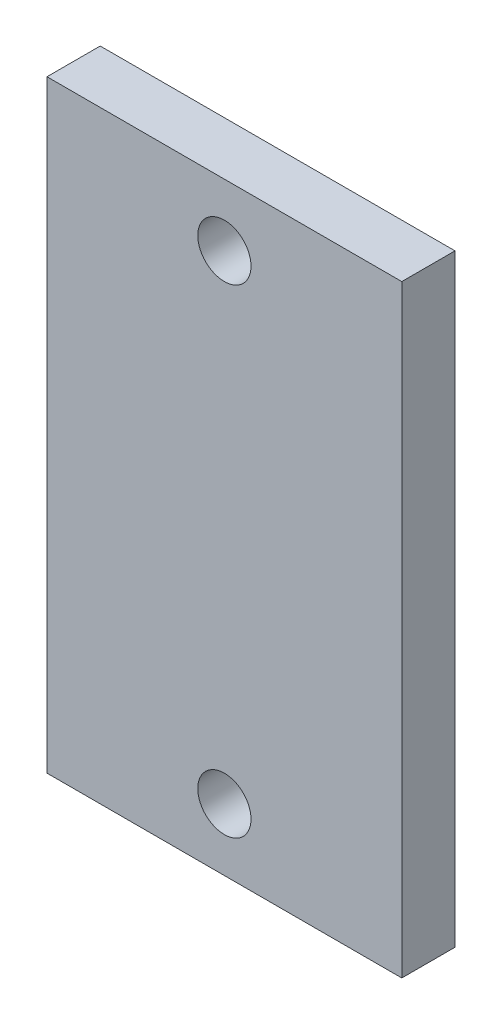
ISO-10303-21;
HEADER;
FILE_DESCRIPTION(('STEP AP214'),'2;1');
FILE_NAME('part.step','',(''),(''),'','','');
FILE_SCHEMA(('AUTOMOTIVE_DESIGN { 1 0 10303 214 1 1 1 1 }'));
ENDSEC;
DATA;
#1=APPLICATION_CONTEXT('core data for automotive mechanical design processes');
#2=APPLICATION_PROTOCOL_DEFINITION('international standard','automotive_design',2000,#1);
#3=PRODUCT_CONTEXT('',#1,'mechanical');
#4=PRODUCT('Part','Part','',(#3));
#5=PRODUCT_RELATED_PRODUCT_CATEGORY('part','',(#4));
#6=PRODUCT_DEFINITION_FORMATION('','',#4);
#7=PRODUCT_DEFINITION_CONTEXT('part definition',#1,'design');
#8=PRODUCT_DEFINITION('design','',#6,#7);
#9=PRODUCT_DEFINITION_SHAPE('','',#8);
#10=(LENGTH_UNIT() NAMED_UNIT(*) SI_UNIT(.MILLI.,.METRE.));
#11=(NAMED_UNIT(*) PLANE_ANGLE_UNIT() SI_UNIT($,.RADIAN.));
#12=(NAMED_UNIT(*) SI_UNIT($,.STERADIAN.) SOLID_ANGLE_UNIT());
#13=UNCERTAINTY_MEASURE_WITH_UNIT(LENGTH_MEASURE(1.E-05),#10,'distance_accuracy_value','');
#14=(GEOMETRIC_REPRESENTATION_CONTEXT(3) GLOBAL_UNCERTAINTY_ASSIGNED_CONTEXT((#13)) GLOBAL_UNIT_ASSIGNED_CONTEXT((#10,
#11,#12)) REPRESENTATION_CONTEXT('',''));
#15=CARTESIAN_POINT('',(0.,0.,0.));
#16=DIRECTION('',(0.,0.,1.));
#17=DIRECTION('',(1.,0.,0.));
#18=AXIS2_PLACEMENT_3D('',#15,#16,#17);
#19=CARTESIAN_POINT('',(0.,0.,3.));
#20=DIRECTION('',(0.,0.,1.));
#21=DIRECTION('',(1.,0.,0.));
#22=AXIS2_PLACEMENT_3D('',#19,#20,#21);
#23=PLANE('',#22);
#24=CARTESIAN_POINT('',(1.72404837269702,3.34684684684684,3.));
#25=DIRECTION('',(0.,0.,1.));
#26=DIRECTION('',(1.,0.,0.));
#27=AXIS2_PLACEMENT_3D('',#24,#25,#26);
#28=CIRCLE('',#27,1.5);
#29=CARTESIAN_POINT('',(3.22404837269702,3.34684684684684,3.));
#30=VERTEX_POINT('',#29);
#31=EDGE_CURVE('E99',#30,#30,#28,.T.);
#32=ORIENTED_EDGE('',*,*,#31,.F.);
#33=EDGE_LOOP('',(#32));
#34=FACE_BOUND('',#33,.T.);
#35=DIRECTION('',(0.,-1.,0.));
#36=VECTOR('',#35,1.);
#37=CARTESIAN_POINT('',(-8.27595162730299,6.84684684684685,3.));
#38=LINE('',#37,#36);
#39=CARTESIAN_POINT('',(-8.27595162730299,6.84684684684685,3.));
#40=VERTEX_POINT('',#39);
#41=CARTESIAN_POINT('',(-8.27595162730299,-27.1531531531532,3.));
#42=VERTEX_POINT('',#41);
#43=EDGE_CURVE('E84',#40,#42,#38,.T.);
#44=ORIENTED_EDGE('',*,*,#43,.T.);
#45=DIRECTION('',(1.,0.,0.));
#46=VECTOR('',#45,1.);
#47=CARTESIAN_POINT('',(-8.27595162730299,-27.1531531531532,3.));
#48=LINE('',#47,#46);
#49=CARTESIAN_POINT('',(11.724048372697,-27.1531531531532,3.));
#50=VERTEX_POINT('',#49);
#51=EDGE_CURVE('E79',#42,#50,#48,.T.);
#52=ORIENTED_EDGE('',*,*,#51,.T.);
#53=DIRECTION('',(0.,1.,0.));
#54=VECTOR('',#53,1.);
#55=CARTESIAN_POINT('',(11.724048372697,6.84684684684685,3.));
#56=LINE('',#55,#54);
#57=CARTESIAN_POINT('',(11.724048372697,6.84684684684685,3.));
#58=VERTEX_POINT('',#57);
#59=EDGE_CURVE('E82',#50,#58,#56,.T.);
#60=ORIENTED_EDGE('',*,*,#59,.T.);
#61=DIRECTION('',(-1.,0.,0.));
#62=VECTOR('',#61,1.);
#63=CARTESIAN_POINT('',(-8.27595162730299,6.84684684684685,3.));
#64=LINE('',#63,#62);
#65=EDGE_CURVE('E49',#58,#40,#64,.T.);
#66=ORIENTED_EDGE('',*,*,#65,.T.);
#67=EDGE_LOOP('',(#44,#52,#60,#66));
#68=FACE_BOUND('',#67,.T.);
#69=CARTESIAN_POINT('',(1.72404837269702,-23.6531531531532,3.));
#70=DIRECTION('',(0.,0.,1.));
#71=DIRECTION('',(1.,0.,0.));
#72=AXIS2_PLACEMENT_3D('',#69,#70,#71);
#73=CIRCLE('',#72,1.5);
#74=CARTESIAN_POINT('',(3.22404837269702,-23.6531531531532,3.));
#75=VERTEX_POINT('',#74);
#76=EDGE_CURVE('E114',#75,#75,#73,.T.);
#77=ORIENTED_EDGE('',*,*,#76,.F.);
#78=EDGE_LOOP('',(#77));
#79=FACE_BOUND('',#78,.T.);
#80=ADVANCED_FACE('F32',(#34,#68,#79),#23,.T.);
#81=CARTESIAN_POINT('',(0.,0.,0.));
#82=DIRECTION('',(0.,0.,1.));
#83=DIRECTION('',(1.,0.,0.));
#84=AXIS2_PLACEMENT_3D('',#81,#82,#83);
#85=PLANE('',#84);
#86=DIRECTION('',(0.,-1.,0.));
#87=VECTOR('',#86,1.);
#88=CARTESIAN_POINT('',(-8.27595162730299,6.84684684684685,0.));
#89=LINE('',#88,#87);
#90=CARTESIAN_POINT('',(-8.27595162730299,6.84684684684685,0.));
#91=VERTEX_POINT('',#90);
#92=CARTESIAN_POINT('',(-8.27595162730299,-27.1531531531532,0.));
#93=VERTEX_POINT('',#92);
#94=EDGE_CURVE('E96',#91,#93,#89,.T.);
#95=ORIENTED_EDGE('',*,*,#94,.F.);
#96=DIRECTION('',(-1.,0.,0.));
#97=VECTOR('',#96,1.);
#98=CARTESIAN_POINT('',(-8.27595162730299,6.84684684684685,0.));
#99=LINE('',#98,#97);
#100=CARTESIAN_POINT('',(11.724048372697,6.84684684684685,0.));
#101=VERTEX_POINT('',#100);
#102=EDGE_CURVE('E72',#101,#91,#99,.T.);
#103=ORIENTED_EDGE('',*,*,#102,.F.);
#104=DIRECTION('',(0.,1.,0.));
#105=VECTOR('',#104,1.);
#106=CARTESIAN_POINT('',(11.724048372697,6.84684684684685,0.));
#107=LINE('',#106,#105);
#108=CARTESIAN_POINT('',(11.724048372697,-27.1531531531532,0.));
#109=VERTEX_POINT('',#108);
#110=EDGE_CURVE('E66',#109,#101,#107,.T.);
#111=ORIENTED_EDGE('',*,*,#110,.F.);
#112=DIRECTION('',(1.,0.,0.));
#113=VECTOR('',#112,1.);
#114=CARTESIAN_POINT('',(-8.27595162730299,-27.1531531531532,0.));
#115=LINE('',#114,#113);
#116=EDGE_CURVE('E88',#93,#109,#115,.T.);
#117=ORIENTED_EDGE('',*,*,#116,.F.);
#118=EDGE_LOOP('',(#95,#103,#111,#117));
#119=FACE_BOUND('',#118,.T.);
#120=CARTESIAN_POINT('',(1.72404837269702,3.34684684684684,0.));
#121=DIRECTION('',(0.,0.,1.));
#122=DIRECTION('',(1.,0.,0.));
#123=AXIS2_PLACEMENT_3D('',#120,#121,#122);
#124=CIRCLE('',#123,1.5);
#125=CARTESIAN_POINT('',(3.22404837269702,3.34684684684684,0.));
#126=VERTEX_POINT('',#125);
#127=EDGE_CURVE('E111',#126,#126,#124,.T.);
#128=ORIENTED_EDGE('',*,*,#127,.T.);
#129=EDGE_LOOP('',(#128));
#130=FACE_BOUND('',#129,.T.);
#131=CARTESIAN_POINT('',(1.72404837269702,-23.6531531531532,0.));
#132=DIRECTION('',(0.,0.,1.));
#133=DIRECTION('',(1.,0.,0.));
#134=AXIS2_PLACEMENT_3D('',#131,#132,#133);
#135=CIRCLE('',#134,1.5);
#136=CARTESIAN_POINT('',(3.22404837269702,-23.6531531531532,0.));
#137=VERTEX_POINT('',#136);
#138=EDGE_CURVE('E117',#137,#137,#135,.T.);
#139=ORIENTED_EDGE('',*,*,#138,.T.);
#140=EDGE_LOOP('',(#139));
#141=FACE_BOUND('',#140,.T.);
#142=ADVANCED_FACE('F107',(#119,#130,#141),#85,.F.);
#143=CARTESIAN_POINT('',(-8.27595162730299,6.84684684684685,3.));
#144=DIRECTION('',(1.,0.,0.));
#145=DIRECTION('',(0.,0.,-1.));
#146=AXIS2_PLACEMENT_3D('',#143,#144,#145);
#147=PLANE('',#146);
#148=ORIENTED_EDGE('',*,*,#94,.T.);
#149=DIRECTION('',(0.,0.,-1.));
#150=VECTOR('',#149,1.);
#151=CARTESIAN_POINT('',(-8.27595162730299,-27.1531531531532,3.));
#152=LINE('',#151,#150);
#153=EDGE_CURVE('E11',#42,#93,#152,.T.);
#154=ORIENTED_EDGE('',*,*,#153,.F.);
#155=ORIENTED_EDGE('',*,*,#43,.F.);
#156=DIRECTION('',(0.,0.,-1.));
#157=VECTOR('',#156,1.);
#158=CARTESIAN_POINT('',(-8.27595162730299,6.84684684684685,3.));
#159=LINE('',#158,#157);
#160=EDGE_CURVE('E92',#40,#91,#159,.T.);
#161=ORIENTED_EDGE('',*,*,#160,.T.);
#162=EDGE_LOOP('',(#148,#154,#155,#161));
#163=FACE_BOUND('',#162,.T.);
#164=ADVANCED_FACE('F34',(#163),#147,.F.);
#165=CARTESIAN_POINT('',(-8.27595162730299,-27.1531531531532,3.));
#166=DIRECTION('',(0.,1.,0.));
#167=DIRECTION('',(-1.,0.,0.));
#168=AXIS2_PLACEMENT_3D('',#165,#166,#167);
#169=PLANE('',#168);
#170=ORIENTED_EDGE('',*,*,#116,.T.);
#171=DIRECTION('',(0.,0.,-1.));
#172=VECTOR('',#171,1.);
#173=CARTESIAN_POINT('',(11.724048372697,-27.1531531531532,3.));
#174=LINE('',#173,#172);
#175=EDGE_CURVE('E41',#50,#109,#174,.T.);
#176=ORIENTED_EDGE('',*,*,#175,.F.);
#177=ORIENTED_EDGE('',*,*,#51,.F.);
#178=ORIENTED_EDGE('',*,*,#153,.T.);
#179=EDGE_LOOP('',(#170,#176,#177,#178));
#180=FACE_BOUND('',#179,.T.);
#181=ADVANCED_FACE('F87',(#180),#169,.F.);
#182=CARTESIAN_POINT('',(11.724048372697,6.84684684684685,3.));
#183=DIRECTION('',(-1.,0.,0.));
#184=DIRECTION('',(0.,-1.,0.));
#185=AXIS2_PLACEMENT_3D('',#182,#183,#184);
#186=PLANE('',#185);
#187=ORIENTED_EDGE('',*,*,#110,.T.);
#188=DIRECTION('',(0.,0.,-1.));
#189=VECTOR('',#188,1.);
#190=CARTESIAN_POINT('',(11.724048372697,6.84684684684685,3.));
#191=LINE('',#190,#189);
#192=EDGE_CURVE('E89',#58,#101,#191,.T.);
#193=ORIENTED_EDGE('',*,*,#192,.F.);
#194=ORIENTED_EDGE('',*,*,#59,.F.);
#195=ORIENTED_EDGE('',*,*,#175,.T.);
#196=EDGE_LOOP('',(#187,#193,#194,#195));
#197=FACE_BOUND('',#196,.T.);
#198=ADVANCED_FACE('F90',(#197),#186,.F.);
#199=CARTESIAN_POINT('',(-8.27595162730299,6.84684684684685,3.));
#200=DIRECTION('',(0.,-1.,0.));
#201=DIRECTION('',(1.,0.,0.));
#202=AXIS2_PLACEMENT_3D('',#199,#200,#201);
#203=PLANE('',#202);
#204=ORIENTED_EDGE('',*,*,#102,.T.);
#205=ORIENTED_EDGE('',*,*,#160,.F.);
#206=ORIENTED_EDGE('',*,*,#65,.F.);
#207=ORIENTED_EDGE('',*,*,#192,.T.);
#208=EDGE_LOOP('',(#204,#205,#206,#207));
#209=FACE_BOUND('',#208,.T.);
#210=ADVANCED_FACE('F104',(#209),#203,.F.);
#211=CARTESIAN_POINT('',(1.72404837269702,3.34684684684684,3.));
#212=DIRECTION('',(0.,0.,-1.));
#213=DIRECTION('',(-1.,0.,0.));
#214=AXIS2_PLACEMENT_3D('',#211,#212,#213);
#215=CYLINDRICAL_SURFACE('',#214,1.5);
#216=ORIENTED_EDGE('',*,*,#31,.T.);
#217=EDGE_LOOP('',(#216));
#218=FACE_BOUND('',#217,.T.);
#219=ORIENTED_EDGE('',*,*,#127,.F.);
#220=EDGE_LOOP('',(#219));
#221=FACE_BOUND('',#220,.T.);
#222=ADVANCED_FACE('F134',(#218,#221),#215,.F.);
#223=CARTESIAN_POINT('',(1.72404837269702,-23.6531531531532,3.));
#224=DIRECTION('',(0.,0.,-1.));
#225=DIRECTION('',(-1.,0.,0.));
#226=AXIS2_PLACEMENT_3D('',#223,#224,#225);
#227=CYLINDRICAL_SURFACE('',#226,1.5);
#228=ORIENTED_EDGE('',*,*,#76,.T.);
#229=EDGE_LOOP('',(#228));
#230=FACE_BOUND('',#229,.T.);
#231=ORIENTED_EDGE('',*,*,#138,.F.);
#232=EDGE_LOOP('',(#231));
#233=FACE_BOUND('',#232,.T.);
#234=ADVANCED_FACE('F123',(#230,#233),#227,.F.);
#235=CLOSED_SHELL('',(#80,#142,#164,#181,#198,#210,#222,#234));
#236=MANIFOLD_SOLID_BREP('B2',#235);
#237=ADVANCED_BREP_SHAPE_REPRESENTATION('',(#18,#236),#14);
#238=SHAPE_DEFINITION_REPRESENTATION(#9,#237);
ENDSEC;
END-ISO-10303-21;
